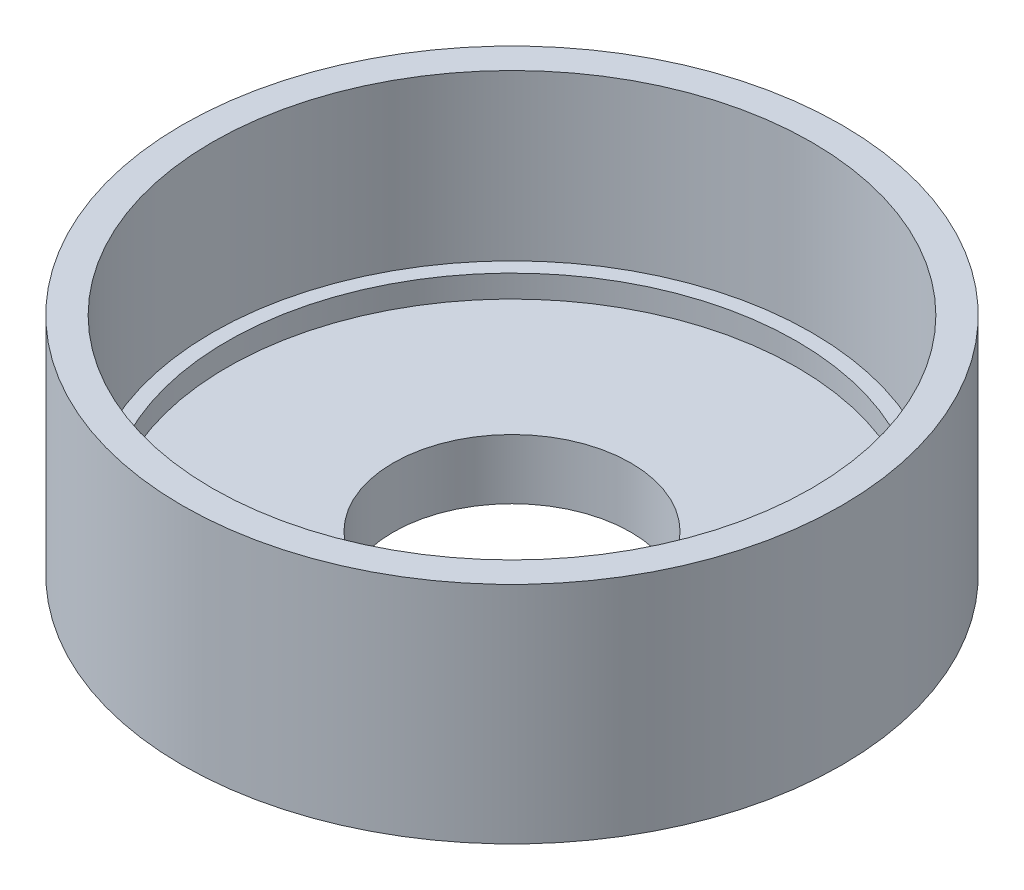
ISO-10303-21;
HEADER;
FILE_DESCRIPTION(('STEP AP214'),'2;1');
FILE_NAME('part.step','',(''),(''),'','','');
FILE_SCHEMA(('AUTOMOTIVE_DESIGN { 1 0 10303 214 1 1 1 1 }'));
ENDSEC;
DATA;
#1=APPLICATION_CONTEXT('core data for automotive mechanical design processes');
#2=APPLICATION_PROTOCOL_DEFINITION('international standard','automotive_design',2000,#1);
#3=PRODUCT_CONTEXT('',#1,'mechanical');
#4=PRODUCT('Part','Part','',(#3));
#5=PRODUCT_RELATED_PRODUCT_CATEGORY('part','',(#4));
#6=PRODUCT_DEFINITION_FORMATION('','',#4);
#7=PRODUCT_DEFINITION_CONTEXT('part definition',#1,'design');
#8=PRODUCT_DEFINITION('design','',#6,#7);
#9=PRODUCT_DEFINITION_SHAPE('','',#8);
#10=(LENGTH_UNIT() NAMED_UNIT(*) SI_UNIT(.MILLI.,.METRE.));
#11=(NAMED_UNIT(*) PLANE_ANGLE_UNIT() SI_UNIT($,.RADIAN.));
#12=(NAMED_UNIT(*) SI_UNIT($,.STERADIAN.) SOLID_ANGLE_UNIT());
#13=UNCERTAINTY_MEASURE_WITH_UNIT(LENGTH_MEASURE(1.E-05),#10,'distance_accuracy_value','');
#14=(GEOMETRIC_REPRESENTATION_CONTEXT(3) GLOBAL_UNCERTAINTY_ASSIGNED_CONTEXT((#13)) GLOBAL_UNIT_ASSIGNED_CONTEXT((#10,
#11,#12)) REPRESENTATION_CONTEXT('',''));
#15=CARTESIAN_POINT('',(0.,0.,0.));
#16=DIRECTION('',(0.,0.,1.));
#17=DIRECTION('',(1.,0.,0.));
#18=AXIS2_PLACEMENT_3D('',#15,#16,#17);
#19=CARTESIAN_POINT('',(0.,-4.,0.));
#20=DIRECTION('',(0.,1.,0.));
#21=DIRECTION('',(0.,0.,1.));
#22=AXIS2_PLACEMENT_3D('',#19,#20,#21);
#23=PLANE('',#22);
#24=CARTESIAN_POINT('',(0.,-4.,0.));
#25=DIRECTION('',(0.,1.,0.));
#26=DIRECTION('',(0.,0.,1.));
#27=AXIS2_PLACEMENT_3D('',#24,#25,#26);
#28=CIRCLE('',#27,9.99999999999997);
#29=CARTESIAN_POINT('',(0.,-4.,9.99999999999997));
#30=VERTEX_POINT('',#29);
#31=EDGE_CURVE('E11',#30,#30,#28,.T.);
#32=ORIENTED_EDGE('',*,*,#31,.T.);
#33=EDGE_LOOP('',(#32));
#34=FACE_BOUND('',#33,.T.);
#35=CARTESIAN_POINT('',(0.,-4.,0.));
#36=DIRECTION('',(0.,1.,0.));
#37=DIRECTION('',(0.,0.,1.));
#38=AXIS2_PLACEMENT_3D('',#35,#36,#37);
#39=CIRCLE('',#38,22.);
#40=CARTESIAN_POINT('',(0.,-4.,22.));
#41=VERTEX_POINT('',#40);
#42=EDGE_CURVE('E69',#41,#41,#39,.T.);
#43=ORIENTED_EDGE('',*,*,#42,.F.);
#44=EDGE_LOOP('',(#43));
#45=FACE_BOUND('',#44,.T.);
#46=ADVANCED_FACE('F53',(#34,#45),#23,.F.);
#47=CARTESIAN_POINT('',(0.,-4.,0.));
#48=DIRECTION('',(0.,1.,0.));
#49=DIRECTION('',(0.,0.,1.));
#50=AXIS2_PLACEMENT_3D('',#47,#48,#49);
#51=CYLINDRICAL_SURFACE('',#50,7.93);
#52=CARTESIAN_POINT('',(0.,-1.5,0.));
#53=DIRECTION('',(0.,1.,0.));
#54=DIRECTION('',(0.,0.,1.));
#55=AXIS2_PLACEMENT_3D('',#52,#53,#54);
#56=CIRCLE('',#55,7.93);
#57=CARTESIAN_POINT('',(0.,-1.5,7.93));
#58=VERTEX_POINT('',#57);
#59=EDGE_CURVE('E72',#58,#58,#56,.F.);
#60=ORIENTED_EDGE('',*,*,#59,.F.);
#61=EDGE_LOOP('',(#60));
#62=FACE_BOUND('',#61,.T.);
#63=CARTESIAN_POINT('',(0.,-5.5,0.));
#64=DIRECTION('',(0.,-1.,0.));
#65=DIRECTION('',(0.,0.,-1.));
#66=AXIS2_PLACEMENT_3D('',#63,#64,#65);
#67=CIRCLE('',#66,7.93);
#68=CARTESIAN_POINT('',(0.,-5.5,-7.93));
#69=VERTEX_POINT('',#68);
#70=EDGE_CURVE('E87',#69,#69,#67,.T.);
#71=ORIENTED_EDGE('',*,*,#70,.T.);
#72=EDGE_LOOP('',(#71));
#73=FACE_BOUND('',#72,.T.);
#74=ADVANCED_FACE('F93',(#62,#73),#51,.F.);
#75=CARTESIAN_POINT('',(0.,0.,0.));
#76=DIRECTION('',(0.,1.,0.));
#77=DIRECTION('',(0.,0.,1.));
#78=AXIS2_PLACEMENT_3D('',#75,#76,#77);
#79=PLANE('',#78);
#80=CARTESIAN_POINT('',(0.,0.,0.));
#81=DIRECTION('',(0.,1.,0.));
#82=DIRECTION('',(0.,0.,1.));
#83=AXIS2_PLACEMENT_3D('',#80,#81,#82);
#84=CIRCLE('',#83,19.);
#85=CARTESIAN_POINT('',(0.,0.,19.));
#86=VERTEX_POINT('',#85);
#87=EDGE_CURVE('E84',#86,#86,#84,.T.);
#88=ORIENTED_EDGE('',*,*,#87,.F.);
#89=EDGE_LOOP('',(#88));
#90=FACE_BOUND('',#89,.T.);
#91=CARTESIAN_POINT('',(0.,0.,0.));
#92=DIRECTION('',(0.,1.,0.));
#93=DIRECTION('',(0.,0.,1.));
#94=AXIS2_PLACEMENT_3D('',#91,#92,#93);
#95=CIRCLE('',#94,20.);
#96=CARTESIAN_POINT('',(0.,0.,20.));
#97=VERTEX_POINT('',#96);
#98=EDGE_CURVE('E65',#97,#97,#95,.F.);
#99=ORIENTED_EDGE('',*,*,#98,.F.);
#100=EDGE_LOOP('',(#99));
#101=FACE_BOUND('',#100,.T.);
#102=ADVANCED_FACE('F113',(#90,#101),#79,.T.);
#103=CARTESIAN_POINT('',(0.,-4.,0.));
#104=DIRECTION('',(0.,1.,0.));
#105=DIRECTION('',(0.,0.,1.));
#106=AXIS2_PLACEMENT_3D('',#103,#104,#105);
#107=CYLINDRICAL_SURFACE('',#106,22.);
#108=ORIENTED_EDGE('',*,*,#42,.T.);
#109=EDGE_LOOP('',(#108));
#110=FACE_BOUND('',#109,.T.);
#111=CARTESIAN_POINT('',(0.,11.,0.));
#112=DIRECTION('',(0.,1.,0.));
#113=DIRECTION('',(0.,0.,1.));
#114=AXIS2_PLACEMENT_3D('',#111,#112,#113);
#115=CIRCLE('',#114,22.);
#116=CARTESIAN_POINT('',(0.,11.,22.));
#117=VERTEX_POINT('',#116);
#118=EDGE_CURVE('E79',#117,#117,#115,.T.);
#119=ORIENTED_EDGE('',*,*,#118,.F.);
#120=EDGE_LOOP('',(#119));
#121=FACE_BOUND('',#120,.T.);
#122=ADVANCED_FACE('F120',(#110,#121),#107,.T.);
#123=CARTESIAN_POINT('',(0.,11.,0.));
#124=DIRECTION('',(0.,1.,0.));
#125=DIRECTION('',(0.,0.,1.));
#126=AXIS2_PLACEMENT_3D('',#123,#124,#125);
#127=PLANE('',#126);
#128=ORIENTED_EDGE('',*,*,#118,.T.);
#129=EDGE_LOOP('',(#128));
#130=FACE_BOUND('',#129,.T.);
#131=CARTESIAN_POINT('',(0.,11.,0.));
#132=DIRECTION('',(0.,1.,0.));
#133=DIRECTION('',(0.,0.,1.));
#134=AXIS2_PLACEMENT_3D('',#131,#132,#133);
#135=CIRCLE('',#134,20.);
#136=CARTESIAN_POINT('',(0.,11.,20.));
#137=VERTEX_POINT('',#136);
#138=EDGE_CURVE('E74',#137,#137,#135,.T.);
#139=ORIENTED_EDGE('',*,*,#138,.F.);
#140=EDGE_LOOP('',(#139));
#141=FACE_BOUND('',#140,.T.);
#142=ADVANCED_FACE('F123',(#130,#141),#127,.T.);
#143=CARTESIAN_POINT('',(0.,11.,0.));
#144=DIRECTION('',(0.,-1.,0.));
#145=DIRECTION('',(0.,0.,-1.));
#146=AXIS2_PLACEMENT_3D('',#143,#144,#145);
#147=CYLINDRICAL_SURFACE('',#146,20.);
#148=ORIENTED_EDGE('',*,*,#138,.T.);
#149=EDGE_LOOP('',(#148));
#150=FACE_BOUND('',#149,.T.);
#151=ORIENTED_EDGE('',*,*,#98,.T.);
#152=EDGE_LOOP('',(#151));
#153=FACE_BOUND('',#152,.T.);
#154=ADVANCED_FACE('F128',(#150,#153),#147,.F.);
#155=CARTESIAN_POINT('',(0.,-1.5,0.));
#156=DIRECTION('',(0.,1.,0.));
#157=DIRECTION('',(0.,0.,1.));
#158=AXIS2_PLACEMENT_3D('',#155,#156,#157);
#159=PLANE('',#158);
#160=CARTESIAN_POINT('',(0.,-1.5,0.));
#161=DIRECTION('',(0.,1.,0.));
#162=DIRECTION('',(0.,0.,1.));
#163=AXIS2_PLACEMENT_3D('',#160,#161,#162);
#164=CIRCLE('',#163,19.);
#165=CARTESIAN_POINT('',(0.,-1.5,19.));
#166=VERTEX_POINT('',#165);
#167=EDGE_CURVE('E75',#166,#166,#164,.T.);
#168=ORIENTED_EDGE('',*,*,#167,.T.);
#169=EDGE_LOOP('',(#168));
#170=FACE_BOUND('',#169,.T.);
#171=ORIENTED_EDGE('',*,*,#59,.T.);
#172=EDGE_LOOP('',(#171));
#173=FACE_BOUND('',#172,.T.);
#174=ADVANCED_FACE('F105',(#170,#173),#159,.T.);
#175=CARTESIAN_POINT('',(0.,-1.5,0.));
#176=DIRECTION('',(0.,1.,0.));
#177=DIRECTION('',(0.,0.,1.));
#178=AXIS2_PLACEMENT_3D('',#175,#176,#177);
#179=CYLINDRICAL_SURFACE('',#178,19.);
#180=ORIENTED_EDGE('',*,*,#167,.F.);
#181=EDGE_LOOP('',(#180));
#182=FACE_BOUND('',#181,.T.);
#183=ORIENTED_EDGE('',*,*,#87,.T.);
#184=EDGE_LOOP('',(#183));
#185=FACE_BOUND('',#184,.T.);
#186=ADVANCED_FACE('F97',(#182,#185),#179,.F.);
#187=CARTESIAN_POINT('',(0.,-5.5,0.));
#188=DIRECTION('',(0.,-1.,0.));
#189=DIRECTION('',(0.,0.,-1.));
#190=AXIS2_PLACEMENT_3D('',#187,#188,#189);
#191=PLANE('',#190);
#192=CARTESIAN_POINT('',(0.,-5.5,0.));
#193=DIRECTION('',(0.,-1.,0.));
#194=DIRECTION('',(0.,0.,-1.));
#195=AXIS2_PLACEMENT_3D('',#192,#193,#194);
#196=CIRCLE('',#195,8.49999999999996);
#197=CARTESIAN_POINT('',(0.,-5.5,-8.49999999999996));
#198=VERTEX_POINT('',#197);
#199=EDGE_CURVE('E61',#198,#198,#196,.T.);
#200=ORIENTED_EDGE('',*,*,#199,.T.);
#201=EDGE_LOOP('',(#200));
#202=FACE_BOUND('',#201,.T.);
#203=ORIENTED_EDGE('',*,*,#70,.F.);
#204=EDGE_LOOP('',(#203));
#205=FACE_BOUND('',#204,.T.);
#206=ADVANCED_FACE('F95',(#202,#205),#191,.T.);
#207=CARTESIAN_POINT('',(0.,-5.5,0.));
#208=DIRECTION('',(0.,1.,0.));
#209=DIRECTION('',(0.,0.,1.));
#210=AXIS2_PLACEMENT_3D('',#207,#208,#209);
#211=CONICAL_SURFACE('',#210,8.49999999999996,0.785398163397453);
#212=ORIENTED_EDGE('',*,*,#31,.F.);
#213=EDGE_LOOP('',(#212));
#214=FACE_BOUND('',#213,.T.);
#215=ORIENTED_EDGE('',*,*,#199,.F.);
#216=EDGE_LOOP('',(#215));
#217=FACE_BOUND('',#216,.T.);
#218=ADVANCED_FACE('F56',(#214,#217),#211,.T.);
#219=CLOSED_SHELL('',(#46,#74,#102,#122,#142,#154,#174,#186,#206,#218));
#220=MANIFOLD_SOLID_BREP('B2',#219);
#221=ADVANCED_BREP_SHAPE_REPRESENTATION('',(#18,#220),#14);
#222=SHAPE_DEFINITION_REPRESENTATION(#9,#221);
ENDSEC;
END-ISO-10303-21;
